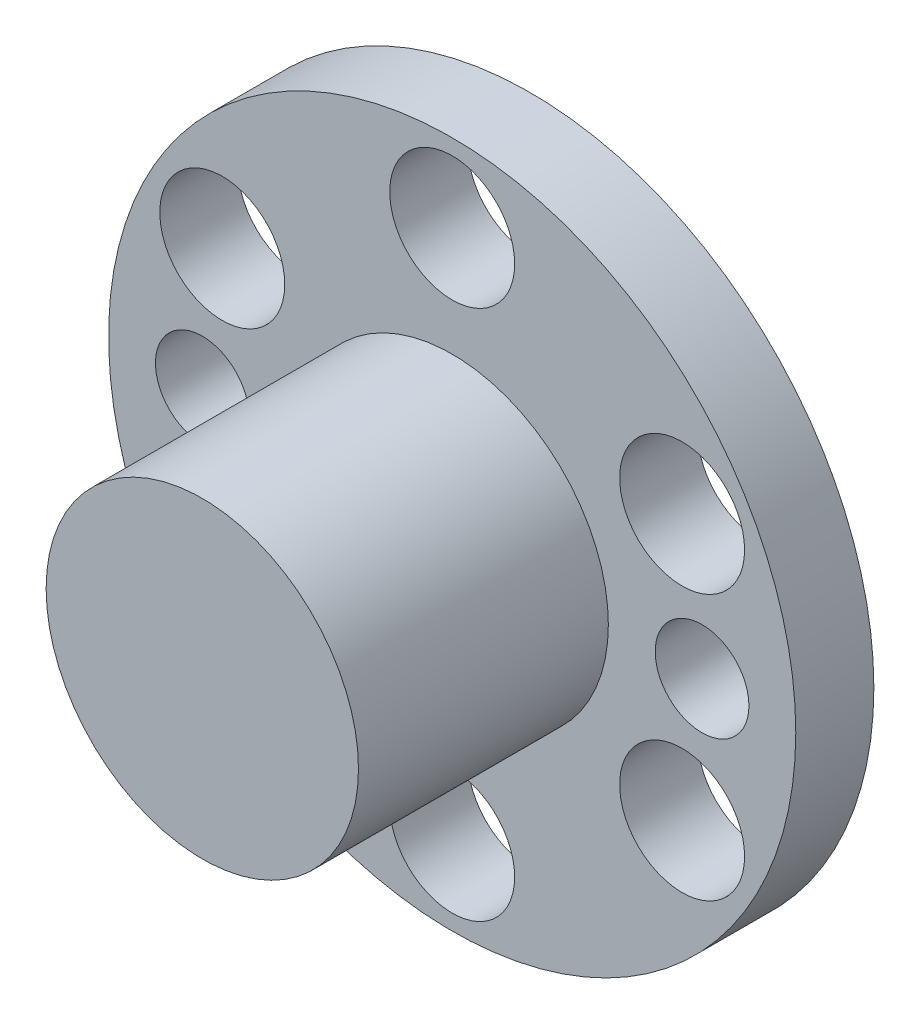
ISO-10303-21;
HEADER;
FILE_DESCRIPTION(('STEP AP214'),'2;1');
FILE_NAME('part.step','',(''),(''),'','','');
FILE_SCHEMA(('AUTOMOTIVE_DESIGN { 1 0 10303 214 1 1 1 1 }'));
ENDSEC;
DATA;
#1=APPLICATION_CONTEXT('core data for automotive mechanical design processes');
#2=APPLICATION_PROTOCOL_DEFINITION('international standard','automotive_design',2000,#1);
#3=PRODUCT_CONTEXT('',#1,'mechanical');
#4=PRODUCT('Part','Part','',(#3));
#5=PRODUCT_RELATED_PRODUCT_CATEGORY('part','',(#4));
#6=PRODUCT_DEFINITION_FORMATION('','',#4);
#7=PRODUCT_DEFINITION_CONTEXT('part definition',#1,'design');
#8=PRODUCT_DEFINITION('design','',#6,#7);
#9=PRODUCT_DEFINITION_SHAPE('','',#8);
#10=(LENGTH_UNIT() NAMED_UNIT(*) SI_UNIT(.MILLI.,.METRE.));
#11=(NAMED_UNIT(*) PLANE_ANGLE_UNIT() SI_UNIT($,.RADIAN.));
#12=(NAMED_UNIT(*) SI_UNIT($,.STERADIAN.) SOLID_ANGLE_UNIT());
#13=UNCERTAINTY_MEASURE_WITH_UNIT(LENGTH_MEASURE(1.E-05),#10,'distance_accuracy_value','');
#14=(GEOMETRIC_REPRESENTATION_CONTEXT(3) GLOBAL_UNCERTAINTY_ASSIGNED_CONTEXT((#13)) GLOBAL_UNIT_ASSIGNED_CONTEXT((#10,
#11,#12)) REPRESENTATION_CONTEXT('',''));
#15=CARTESIAN_POINT('',(0.,0.,0.));
#16=DIRECTION('',(0.,0.,1.));
#17=DIRECTION('',(1.,0.,0.));
#18=AXIS2_PLACEMENT_3D('',#15,#16,#17);
#19=CARTESIAN_POINT('',(10.4227380596182,-11.548442810204,0.));
#20=DIRECTION('',(0.,0.,1.));
#21=DIRECTION('',(1.,0.,0.));
#22=AXIS2_PLACEMENT_3D('',#19,#20,#21);
#23=PLANE('',#22);
#24=CARTESIAN_POINT('',(10.4227380596182,-11.548442810204,0.));
#25=DIRECTION('',(0.,0.,1.));
#26=DIRECTION('',(-1.,0.,0.));
#27=AXIS2_PLACEMENT_3D('',#24,#25,#26);
#28=CIRCLE('',#27,11.);
#29=CARTESIAN_POINT('',(21.4227380596182,-11.548442810204,0.));
#30=VERTEX_POINT('',#29);
#31=EDGE_CURVE('P0_E11',#30,#30,#28,.T.);
#32=ORIENTED_EDGE('',*,*,#31,.F.);
#33=EDGE_LOOP('',(#32));
#34=FACE_BOUND('',#33,.T.);
#35=CARTESIAN_POINT('',(2.42273805961815,-11.548442810204,0.));
#36=DIRECTION('',(0.,0.,1.));
#37=DIRECTION('',(-1.,0.,0.));
#38=AXIS2_PLACEMENT_3D('',#35,#36,#37);
#39=CIRCLE('',#38,1.5);
#40=CARTESIAN_POINT('',(3.92273805961816,-11.548442810204,0.));
#41=VERTEX_POINT('',#40);
#42=EDGE_CURVE('P0_E126',#41,#41,#39,.T.);
#43=ORIENTED_EDGE('',*,*,#42,.T.);
#44=EDGE_LOOP('',(#43));
#45=FACE_BOUND('',#44,.T.);
#46=CARTESIAN_POINT('',(18.4227380596182,-11.548442810204,0.));
#47=DIRECTION('',(0.,0.,1.));
#48=DIRECTION('',(-1.,0.,0.));
#49=AXIS2_PLACEMENT_3D('',#46,#47,#48);
#50=CIRCLE('',#49,1.5);
#51=CARTESIAN_POINT('',(19.9227380596182,-11.548442810204,0.));
#52=VERTEX_POINT('',#51);
#53=EDGE_CURVE('P0_E120',#52,#52,#50,.T.);
#54=ORIENTED_EDGE('',*,*,#53,.T.);
#55=EDGE_LOOP('',(#54));
#56=FACE_BOUND('',#55,.T.);
#57=CARTESIAN_POINT('',(3.06152212745041,-7.29844281020397,0.));
#58=DIRECTION('',(0.,0.,1.));
#59=DIRECTION('',(-1.,0.,0.));
#60=AXIS2_PLACEMENT_3D('',#57,#58,#59);
#61=CIRCLE('',#60,2.);
#62=CARTESIAN_POINT('',(5.06152212745042,-7.29844281020397,0.));
#63=VERTEX_POINT('',#62);
#64=EDGE_CURVE('P0_E109',#63,#63,#61,.T.);
#65=ORIENTED_EDGE('',*,*,#64,.T.);
#66=EDGE_LOOP('',(#65));
#67=FACE_BOUND('',#66,.T.);
#68=CARTESIAN_POINT('',(17.7839539917859,-7.29844281020397,0.));
#69=DIRECTION('',(0.,0.,1.));
#70=DIRECTION('',(-1.,0.,0.));
#71=AXIS2_PLACEMENT_3D('',#68,#69,#70);
#72=CIRCLE('',#71,2.);
#73=CARTESIAN_POINT('',(19.7839539917859,-7.29844281020397,0.));
#74=VERTEX_POINT('',#73);
#75=EDGE_CURVE('P0_E105',#74,#74,#72,.T.);
#76=ORIENTED_EDGE('',*,*,#75,.T.);
#77=EDGE_LOOP('',(#76));
#78=FACE_BOUND('',#77,.T.);
#79=CARTESIAN_POINT('',(10.4227380596182,-20.048442810204,0.));
#80=DIRECTION('',(0.,0.,1.));
#81=DIRECTION('',(-1.,0.,0.));
#82=AXIS2_PLACEMENT_3D('',#79,#80,#81);
#83=CIRCLE('',#82,2.);
#84=CARTESIAN_POINT('',(10.4227380596182,-18.048442810204,0.));
#85=VERTEX_POINT('',#84);
#86=EDGE_CURVE('P0_E117',#85,#85,#83,.T.);
#87=ORIENTED_EDGE('',*,*,#86,.T.);
#88=EDGE_LOOP('',(#87));
#89=FACE_BOUND('',#88,.T.);
#90=CARTESIAN_POINT('',(10.4227380596182,-3.04844281020396,0.));
#91=DIRECTION('',(0.,0.,1.));
#92=DIRECTION('',(-1.,0.,0.));
#93=AXIS2_PLACEMENT_3D('',#90,#91,#92);
#94=CIRCLE('',#93,2.);
#95=CARTESIAN_POINT('',(10.4227380596182,-5.04844281020397,0.));
#96=VERTEX_POINT('',#95);
#97=EDGE_CURVE('P0_E94',#96,#96,#94,.T.);
#98=ORIENTED_EDGE('',*,*,#97,.T.);
#99=EDGE_LOOP('',(#98));
#100=FACE_BOUND('',#99,.T.);
#101=CARTESIAN_POINT('',(3.06152212745041,-15.798442810204,0.));
#102=DIRECTION('',(0.,0.,1.));
#103=DIRECTION('',(-1.,0.,0.));
#104=AXIS2_PLACEMENT_3D('',#101,#102,#103);
#105=CIRCLE('',#104,2.);
#106=CARTESIAN_POINT('',(5.06152212745042,-15.798442810204,0.));
#107=VERTEX_POINT('',#106);
#108=EDGE_CURVE('P0_E88',#107,#107,#105,.T.);
#109=ORIENTED_EDGE('',*,*,#108,.T.);
#110=EDGE_LOOP('',(#109));
#111=FACE_BOUND('',#110,.T.);
#112=CARTESIAN_POINT('',(17.7839539917859,-15.798442810204,0.));
#113=DIRECTION('',(0.,0.,1.));
#114=DIRECTION('',(-1.,0.,0.));
#115=AXIS2_PLACEMENT_3D('',#112,#113,#114);
#116=CIRCLE('',#115,2.);
#117=CARTESIAN_POINT('',(19.7839539917859,-15.798442810204,0.));
#118=VERTEX_POINT('',#117);
#119=EDGE_CURVE('P0_E99',#118,#118,#116,.T.);
#120=ORIENTED_EDGE('',*,*,#119,.T.);
#121=EDGE_LOOP('',(#120));
#122=FACE_BOUND('',#121,.T.);
#123=ADVANCED_FACE('P0_F17',(#34,#45,#56,#67,#78,#89,#100,#111,#122),#23,.F.);
#124=CARTESIAN_POINT('',(10.4227380596182,-11.548442810204,2.5));
#125=DIRECTION('',(0.,0.,1.));
#126=DIRECTION('',(1.,0.,0.));
#127=AXIS2_PLACEMENT_3D('',#124,#125,#126);
#128=PLANE('',#127);
#129=CARTESIAN_POINT('',(10.4227380596182,-11.548442810204,2.5));
#130=DIRECTION('',(0.,0.,1.));
#131=DIRECTION('',(-1.,0.,0.));
#132=AXIS2_PLACEMENT_3D('',#129,#130,#131);
#133=CIRCLE('',#132,11.);
#134=CARTESIAN_POINT('',(21.4227380596182,-11.548442810204,2.5));
#135=VERTEX_POINT('',#134);
#136=EDGE_CURVE('P0_E26',#135,#135,#133,.T.);
#137=ORIENTED_EDGE('',*,*,#136,.T.);
#138=EDGE_LOOP('',(#137));
#139=FACE_BOUND('',#138,.T.);
#140=CARTESIAN_POINT('',(2.42273805961815,-11.548442810204,2.5));
#141=DIRECTION('',(0.,0.,-1.));
#142=DIRECTION('',(-1.,0.,0.));
#143=AXIS2_PLACEMENT_3D('',#140,#141,#142);
#144=CIRCLE('',#143,1.5);
#145=CARTESIAN_POINT('',(3.92273805961816,-11.548442810204,2.5));
#146=VERTEX_POINT('',#145);
#147=EDGE_CURVE('P0_E129',#146,#146,#144,.T.);
#148=ORIENTED_EDGE('',*,*,#147,.T.);
#149=EDGE_LOOP('',(#148));
#150=FACE_BOUND('',#149,.T.);
#151=CARTESIAN_POINT('',(18.4227380596182,-11.548442810204,2.5));
#152=DIRECTION('',(0.,0.,-1.));
#153=DIRECTION('',(-1.,0.,0.));
#154=AXIS2_PLACEMENT_3D('',#151,#152,#153);
#155=CIRCLE('',#154,1.5);
#156=CARTESIAN_POINT('',(19.9227380596182,-11.548442810204,2.5));
#157=VERTEX_POINT('',#156);
#158=EDGE_CURVE('P0_E123',#157,#157,#155,.T.);
#159=ORIENTED_EDGE('',*,*,#158,.T.);
#160=EDGE_LOOP('',(#159));
#161=FACE_BOUND('',#160,.T.);
#162=CARTESIAN_POINT('',(3.06152212745041,-7.29844281020397,2.5));
#163=DIRECTION('',(0.,0.,-1.));
#164=DIRECTION('',(-1.,0.,0.));
#165=AXIS2_PLACEMENT_3D('',#162,#163,#164);
#166=CIRCLE('',#165,2.);
#167=CARTESIAN_POINT('',(5.06152212745042,-7.29844281020397,2.5));
#168=VERTEX_POINT('',#167);
#169=EDGE_CURVE('P0_E111',#168,#168,#166,.T.);
#170=ORIENTED_EDGE('',*,*,#169,.T.);
#171=EDGE_LOOP('',(#170));
#172=FACE_BOUND('',#171,.T.);
#173=CARTESIAN_POINT('',(17.7839539917859,-7.29844281020397,2.5));
#174=DIRECTION('',(0.,0.,-1.));
#175=DIRECTION('',(-1.,0.,0.));
#176=AXIS2_PLACEMENT_3D('',#173,#174,#175);
#177=CIRCLE('',#176,2.);
#178=CARTESIAN_POINT('',(19.7839539917859,-7.29844281020397,2.5));
#179=VERTEX_POINT('',#178);
#180=EDGE_CURVE('P0_E107',#179,#179,#177,.T.);
#181=ORIENTED_EDGE('',*,*,#180,.T.);
#182=EDGE_LOOP('',(#181));
#183=FACE_BOUND('',#182,.T.);
#184=CARTESIAN_POINT('',(10.4227380596182,-20.048442810204,2.5));
#185=DIRECTION('',(0.,0.,-1.));
#186=DIRECTION('',(-1.,0.,0.));
#187=AXIS2_PLACEMENT_3D('',#184,#185,#186);
#188=CIRCLE('',#187,2.);
#189=CARTESIAN_POINT('',(12.4227380596182,-20.048442810204,2.5));
#190=VERTEX_POINT('',#189);
#191=EDGE_CURVE('P0_E114',#190,#190,#188,.T.);
#192=ORIENTED_EDGE('',*,*,#191,.T.);
#193=EDGE_LOOP('',(#192));
#194=FACE_BOUND('',#193,.T.);
#195=CARTESIAN_POINT('',(10.4227380596182,-3.04844281020396,2.5));
#196=DIRECTION('',(0.,0.,-1.));
#197=DIRECTION('',(-1.,0.,0.));
#198=AXIS2_PLACEMENT_3D('',#195,#196,#197);
#199=CIRCLE('',#198,2.);
#200=CARTESIAN_POINT('',(12.4227380596182,-3.04844281020396,2.5));
#201=VERTEX_POINT('',#200);
#202=EDGE_CURVE('P0_E87',#201,#201,#199,.T.);
#203=ORIENTED_EDGE('',*,*,#202,.T.);
#204=EDGE_LOOP('',(#203));
#205=FACE_BOUND('',#204,.T.);
#206=CARTESIAN_POINT('',(3.06152212745041,-15.798442810204,2.5));
#207=DIRECTION('',(0.,0.,-1.));
#208=DIRECTION('',(-1.,0.,0.));
#209=AXIS2_PLACEMENT_3D('',#206,#207,#208);
#210=CIRCLE('',#209,2.);
#211=CARTESIAN_POINT('',(5.06152212745042,-15.798442810204,2.5));
#212=VERTEX_POINT('',#211);
#213=EDGE_CURVE('P0_E83',#212,#212,#210,.T.);
#214=ORIENTED_EDGE('',*,*,#213,.T.);
#215=EDGE_LOOP('',(#214));
#216=FACE_BOUND('',#215,.T.);
#217=CARTESIAN_POINT('',(17.7839539917859,-15.798442810204,2.5));
#218=DIRECTION('',(0.,0.,-1.));
#219=DIRECTION('',(-1.,0.,0.));
#220=AXIS2_PLACEMENT_3D('',#217,#218,#219);
#221=CIRCLE('',#220,2.);
#222=CARTESIAN_POINT('',(19.7839539917859,-15.798442810204,2.5));
#223=VERTEX_POINT('',#222);
#224=EDGE_CURVE('P0_E96',#223,#223,#221,.T.);
#225=ORIENTED_EDGE('',*,*,#224,.T.);
#226=EDGE_LOOP('',(#225));
#227=FACE_BOUND('',#226,.T.);
#228=ADVANCED_FACE('P0_F19',(#139,#150,#161,#172,#183,#194,#205,#216,#227),#128,.T.);
#229=CARTESIAN_POINT('',(10.4227380596182,-11.548442810204,0.));
#230=DIRECTION('',(0.,0.,-1.));
#231=DIRECTION('',(-1.,0.,0.));
#232=AXIS2_PLACEMENT_3D('',#229,#230,#231);
#233=CYLINDRICAL_SURFACE('',#232,11.);
#234=ORIENTED_EDGE('',*,*,#31,.T.);
#235=EDGE_LOOP('',(#234));
#236=FACE_BOUND('',#235,.T.);
#237=ORIENTED_EDGE('',*,*,#136,.F.);
#238=EDGE_LOOP('',(#237));
#239=FACE_BOUND('',#238,.T.);
#240=ADVANCED_FACE('P0_F156',(#236,#239),#233,.T.);
#241=CARTESIAN_POINT('',(2.42273805961815,-11.548442810204,2.5));
#242=DIRECTION('',(0.,0.,1.));
#243=DIRECTION('',(-1.,0.,0.));
#244=AXIS2_PLACEMENT_3D('',#241,#242,#243);
#245=CYLINDRICAL_SURFACE('',#244,1.5);
#246=ORIENTED_EDGE('',*,*,#147,.F.);
#247=EDGE_LOOP('',(#246));
#248=FACE_BOUND('',#247,.T.);
#249=ORIENTED_EDGE('',*,*,#42,.F.);
#250=EDGE_LOOP('',(#249));
#251=FACE_BOUND('',#250,.T.);
#252=ADVANCED_FACE('P0_F165',(#248,#251),#245,.F.);
#253=CARTESIAN_POINT('',(18.4227380596182,-11.548442810204,2.5));
#254=DIRECTION('',(0.,0.,1.));
#255=DIRECTION('',(-1.,0.,0.));
#256=AXIS2_PLACEMENT_3D('',#253,#254,#255);
#257=CYLINDRICAL_SURFACE('',#256,1.5);
#258=ORIENTED_EDGE('',*,*,#158,.F.);
#259=EDGE_LOOP('',(#258));
#260=FACE_BOUND('',#259,.T.);
#261=ORIENTED_EDGE('',*,*,#53,.F.);
#262=EDGE_LOOP('',(#261));
#263=FACE_BOUND('',#262,.T.);
#264=ADVANCED_FACE('P0_F172',(#260,#263),#257,.F.);
#265=CARTESIAN_POINT('',(10.4227380596182,-20.048442810204,2.5));
#266=DIRECTION('',(0.,0.,1.));
#267=DIRECTION('',(-1.,0.,0.));
#268=AXIS2_PLACEMENT_3D('',#265,#266,#267);
#269=CYLINDRICAL_SURFACE('',#268,2.);
#270=ORIENTED_EDGE('',*,*,#86,.F.);
#271=EDGE_LOOP('',(#270));
#272=FACE_BOUND('',#271,.T.);
#273=ORIENTED_EDGE('',*,*,#191,.F.);
#274=EDGE_LOOP('',(#273));
#275=FACE_BOUND('',#274,.T.);
#276=ADVANCED_FACE('P0_F188',(#272,#275),#269,.F.);
#277=CARTESIAN_POINT('',(3.06152212745041,-7.29844281020397,2.5));
#278=DIRECTION('',(0.,0.,1.));
#279=DIRECTION('',(-1.,0.,0.));
#280=AXIS2_PLACEMENT_3D('',#277,#278,#279);
#281=CYLINDRICAL_SURFACE('',#280,2.);
#282=ORIENTED_EDGE('',*,*,#169,.F.);
#283=EDGE_LOOP('',(#282));
#284=FACE_BOUND('',#283,.T.);
#285=ORIENTED_EDGE('',*,*,#64,.F.);
#286=EDGE_LOOP('',(#285));
#287=FACE_BOUND('',#286,.T.);
#288=ADVANCED_FACE('P0_F197',(#284,#287),#281,.F.);
#289=CARTESIAN_POINT('',(17.7839539917859,-7.29844281020397,2.5));
#290=DIRECTION('',(0.,0.,1.));
#291=DIRECTION('',(-1.,0.,0.));
#292=AXIS2_PLACEMENT_3D('',#289,#290,#291);
#293=CYLINDRICAL_SURFACE('',#292,2.);
#294=ORIENTED_EDGE('',*,*,#180,.F.);
#295=EDGE_LOOP('',(#294));
#296=FACE_BOUND('',#295,.T.);
#297=ORIENTED_EDGE('',*,*,#75,.F.);
#298=EDGE_LOOP('',(#297));
#299=FACE_BOUND('',#298,.T.);
#300=ADVANCED_FACE('P0_F206',(#296,#299),#293,.F.);
#301=CARTESIAN_POINT('',(10.4227380596182,-3.04844281020396,2.5));
#302=DIRECTION('',(0.,0.,1.));
#303=DIRECTION('',(-1.,0.,0.));
#304=AXIS2_PLACEMENT_3D('',#301,#302,#303);
#305=CYLINDRICAL_SURFACE('',#304,2.);
#306=ORIENTED_EDGE('',*,*,#97,.F.);
#307=EDGE_LOOP('',(#306));
#308=FACE_BOUND('',#307,.T.);
#309=ORIENTED_EDGE('',*,*,#202,.F.);
#310=EDGE_LOOP('',(#309));
#311=FACE_BOUND('',#310,.T.);
#312=ADVANCED_FACE('P0_F215',(#308,#311),#305,.F.);
#313=CARTESIAN_POINT('',(3.06152212745041,-15.798442810204,2.5));
#314=DIRECTION('',(0.,0.,1.));
#315=DIRECTION('',(-1.,0.,0.));
#316=AXIS2_PLACEMENT_3D('',#313,#314,#315);
#317=CYLINDRICAL_SURFACE('',#316,2.);
#318=ORIENTED_EDGE('',*,*,#213,.F.);
#319=EDGE_LOOP('',(#318));
#320=FACE_BOUND('',#319,.T.);
#321=ORIENTED_EDGE('',*,*,#108,.F.);
#322=EDGE_LOOP('',(#321));
#323=FACE_BOUND('',#322,.T.);
#324=ADVANCED_FACE('P0_F224',(#320,#323),#317,.F.);
#325=CARTESIAN_POINT('',(17.7839539917859,-15.798442810204,2.5));
#326=DIRECTION('',(0.,0.,1.));
#327=DIRECTION('',(-1.,0.,0.));
#328=AXIS2_PLACEMENT_3D('',#325,#326,#327);
#329=CYLINDRICAL_SURFACE('',#328,2.);
#330=ORIENTED_EDGE('',*,*,#224,.F.);
#331=EDGE_LOOP('',(#330));
#332=FACE_BOUND('',#331,.T.);
#333=ORIENTED_EDGE('',*,*,#119,.F.);
#334=EDGE_LOOP('',(#333));
#335=FACE_BOUND('',#334,.T.);
#336=ADVANCED_FACE('P0_F233',(#332,#335),#329,.F.);
#337=CLOSED_SHELL('',(#123,#228,#240,#252,#264,#276,#288,#300,#312,#324,#336));
#338=MANIFOLD_SOLID_BREP('P0_B1',#337);
#339=CARTESIAN_POINT('',(10.422738059618,-11.548442810204,2.5));
#340=DIRECTION('',(0.,0.,1.));
#341=DIRECTION('',(1.,0.,0.));
#342=AXIS2_PLACEMENT_3D('',#339,#340,#341);
#343=PLANE('',#342);
#344=CARTESIAN_POINT('',(10.4227380596182,-11.548442810204,2.5));
#345=DIRECTION('',(0.,0.,1.));
#346=DIRECTION('',(-1.,0.,0.));
#347=AXIS2_PLACEMENT_3D('',#344,#345,#346);
#348=CIRCLE('',#347,5.);
#349=CARTESIAN_POINT('',(15.4227380596182,-11.548442810204,2.5));
#350=VERTEX_POINT('',#349);
#351=EDGE_CURVE('P1_E10',#350,#350,#348,.T.);
#352=ORIENTED_EDGE('',*,*,#351,.F.);
#353=EDGE_LOOP('',(#352));
#354=FACE_BOUND('',#353,.T.);
#355=ADVANCED_FACE('P1_F16',(#354),#343,.F.);
#356=CARTESIAN_POINT('',(10.422738059618,-11.548442810204,10.5));
#357=DIRECTION('',(0.,0.,1.));
#358=DIRECTION('',(1.,0.,0.));
#359=AXIS2_PLACEMENT_3D('',#356,#357,#358);
#360=PLANE('',#359);
#361=CARTESIAN_POINT('',(10.4227380596182,-11.548442810204,10.5));
#362=DIRECTION('',(0.,0.,1.));
#363=DIRECTION('',(-1.,0.,0.));
#364=AXIS2_PLACEMENT_3D('',#361,#362,#363);
#365=CIRCLE('',#364,5.);
#366=CARTESIAN_POINT('',(15.4227380596182,-11.548442810204,10.5));
#367=VERTEX_POINT('',#366);
#368=EDGE_CURVE('P1_E24',#367,#367,#365,.T.);
#369=ORIENTED_EDGE('',*,*,#368,.T.);
#370=EDGE_LOOP('',(#369));
#371=FACE_BOUND('',#370,.T.);
#372=ADVANCED_FACE('P1_F31',(#371),#360,.T.);
#373=CARTESIAN_POINT('',(10.4227380596182,-11.548442810204,2.5));
#374=DIRECTION('',(0.,0.,-1.));
#375=DIRECTION('',(-1.,0.,0.));
#376=AXIS2_PLACEMENT_3D('',#373,#374,#375);
#377=CYLINDRICAL_SURFACE('',#376,5.);
#378=ORIENTED_EDGE('',*,*,#351,.T.);
#379=EDGE_LOOP('',(#378));
#380=FACE_BOUND('',#379,.T.);
#381=ORIENTED_EDGE('',*,*,#368,.F.);
#382=EDGE_LOOP('',(#381));
#383=FACE_BOUND('',#382,.T.);
#384=ADVANCED_FACE('P1_F51',(#380,#383),#377,.T.);
#385=CLOSED_SHELL('',(#355,#372,#384));
#386=MANIFOLD_SOLID_BREP('P1_B1',#385);
#387=ADVANCED_BREP_SHAPE_REPRESENTATION('',(#18,#338,#386),#14);
#388=SHAPE_DEFINITION_REPRESENTATION(#9,#387);
ENDSEC;
END-ISO-10303-21;
